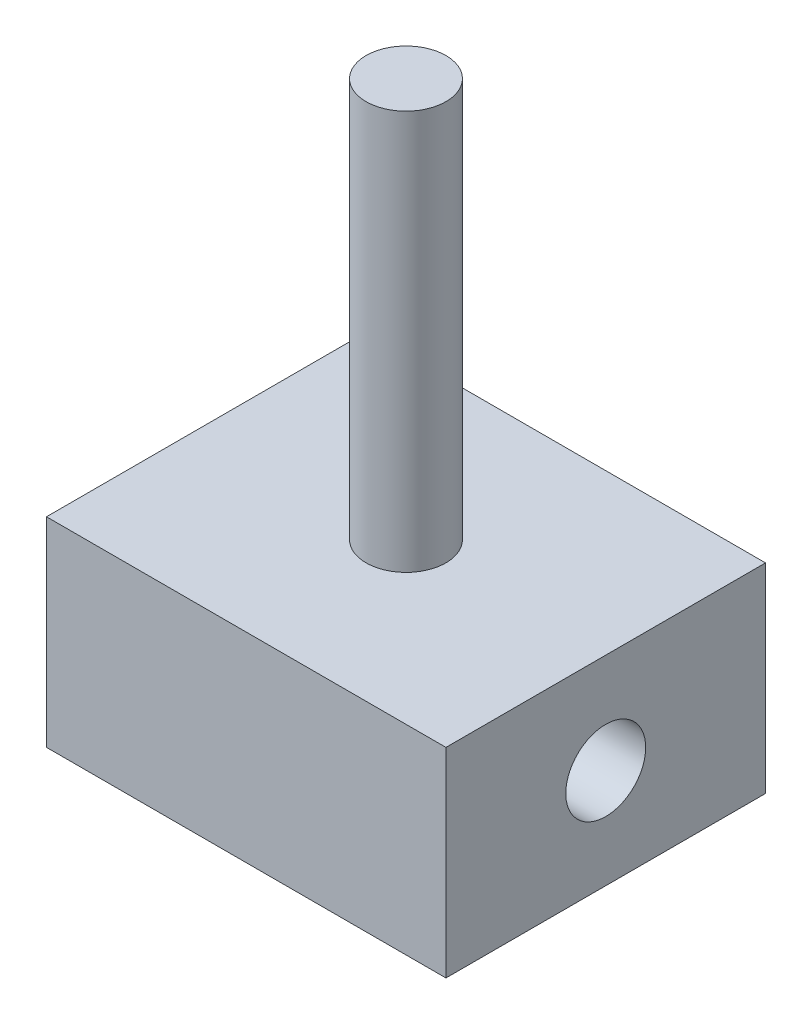
ISO-10303-21;
HEADER;
FILE_DESCRIPTION(('STEP AP214'),'2;1');
FILE_NAME('part.step','',(''),(''),'','','');
FILE_SCHEMA(('AUTOMOTIVE_DESIGN { 1 0 10303 214 1 1 1 1 }'));
ENDSEC;
DATA;
#1=APPLICATION_CONTEXT('core data for automotive mechanical design processes');
#2=APPLICATION_PROTOCOL_DEFINITION('international standard','automotive_design',2000,#1);
#3=PRODUCT_CONTEXT('',#1,'mechanical');
#4=PRODUCT('Part','Part','',(#3));
#5=PRODUCT_RELATED_PRODUCT_CATEGORY('part','',(#4));
#6=PRODUCT_DEFINITION_FORMATION('','',#4);
#7=PRODUCT_DEFINITION_CONTEXT('part definition',#1,'design');
#8=PRODUCT_DEFINITION('design','',#6,#7);
#9=PRODUCT_DEFINITION_SHAPE('','',#8);
#10=(LENGTH_UNIT() NAMED_UNIT(*) SI_UNIT(.MILLI.,.METRE.));
#11=(NAMED_UNIT(*) PLANE_ANGLE_UNIT() SI_UNIT($,.RADIAN.));
#12=(NAMED_UNIT(*) SI_UNIT($,.STERADIAN.) SOLID_ANGLE_UNIT());
#13=UNCERTAINTY_MEASURE_WITH_UNIT(LENGTH_MEASURE(1.E-05),#10,'distance_accuracy_value','');
#14=(GEOMETRIC_REPRESENTATION_CONTEXT(3) GLOBAL_UNCERTAINTY_ASSIGNED_CONTEXT((#13)) GLOBAL_UNIT_ASSIGNED_CONTEXT((#10,
#11,#12)) REPRESENTATION_CONTEXT('',''));
#15=CARTESIAN_POINT('',(0.,0.,0.));
#16=DIRECTION('',(0.,0.,1.));
#17=DIRECTION('',(1.,0.,0.));
#18=AXIS2_PLACEMENT_3D('',#15,#16,#17);
#19=CARTESIAN_POINT('',(0.,0.,20.));
#20=DIRECTION('',(0.,1.,0.));
#21=DIRECTION('',(-1.,0.,0.));
#22=AXIS2_PLACEMENT_3D('',#19,#20,#21);
#23=PLANE('',#22);
#24=DIRECTION('',(1.,0.,0.));
#25=VECTOR('',#24,1.);
#26=CARTESIAN_POINT('',(0.,0.,-20.));
#27=LINE('',#26,#25);
#28=CARTESIAN_POINT('',(-25.,0.,-20.));
#29=VERTEX_POINT('',#28);
#30=CARTESIAN_POINT('',(25.,0.,-20.));
#31=VERTEX_POINT('',#30);
#32=EDGE_CURVE('E102',#29,#31,#27,.T.);
#33=ORIENTED_EDGE('',*,*,#32,.T.);
#34=DIRECTION('',(0.,0.,-1.));
#35=VECTOR('',#34,1.);
#36=CARTESIAN_POINT('',(25.,0.,20.));
#37=LINE('',#36,#35);
#38=CARTESIAN_POINT('',(25.,0.,20.));
#39=VERTEX_POINT('',#38);
#40=EDGE_CURVE('E39',#39,#31,#37,.T.);
#41=ORIENTED_EDGE('',*,*,#40,.F.);
#42=DIRECTION('',(1.,0.,0.));
#43=VECTOR('',#42,1.);
#44=CARTESIAN_POINT('',(0.,0.,20.));
#45=LINE('',#44,#43);
#46=CARTESIAN_POINT('',(-25.,0.,20.));
#47=VERTEX_POINT('',#46);
#48=EDGE_CURVE('E87',#47,#39,#45,.T.);
#49=ORIENTED_EDGE('',*,*,#48,.F.);
#50=DIRECTION('',(0.,0.,-1.));
#51=VECTOR('',#50,1.);
#52=CARTESIAN_POINT('',(-25.,0.,20.));
#53=LINE('',#52,#51);
#54=EDGE_CURVE('E53',#47,#29,#53,.T.);
#55=ORIENTED_EDGE('',*,*,#54,.T.);
#56=EDGE_LOOP('',(#33,#41,#49,#55));
#57=FACE_BOUND('',#56,.T.);
#58=ADVANCED_FACE('F36',(#57),#23,.F.);
#59=CARTESIAN_POINT('',(25.,0.,20.));
#60=DIRECTION('',(-1.,0.,0.));
#61=DIRECTION('',(0.,-1.,0.));
#62=AXIS2_PLACEMENT_3D('',#59,#60,#61);
#63=PLANE('',#62);
#64=CARTESIAN_POINT('',(25.,12.5,0.));
#65=DIRECTION('',(1.,0.,0.));
#66=DIRECTION('',(0.,1.,0.));
#67=AXIS2_PLACEMENT_3D('',#64,#65,#66);
#68=CIRCLE('',#67,5.);
#69=CARTESIAN_POINT('',(25.,17.5,0.));
#70=VERTEX_POINT('',#69);
#71=EDGE_CURVE('E117',#70,#70,#68,.T.);
#72=ORIENTED_EDGE('',*,*,#71,.F.);
#73=EDGE_LOOP('',(#72));
#74=FACE_BOUND('',#73,.T.);
#75=DIRECTION('',(0.,1.,0.));
#76=VECTOR('',#75,1.);
#77=CARTESIAN_POINT('',(25.,0.,-20.));
#78=LINE('',#77,#76);
#79=CARTESIAN_POINT('',(25.,25.,-20.));
#80=VERTEX_POINT('',#79);
#81=EDGE_CURVE('E93',#31,#80,#78,.T.);
#82=ORIENTED_EDGE('',*,*,#81,.T.);
#83=DIRECTION('',(0.,0.,-1.));
#84=VECTOR('',#83,1.);
#85=CARTESIAN_POINT('',(25.,25.,20.));
#86=LINE('',#85,#84);
#87=CARTESIAN_POINT('',(25.,25.,20.));
#88=VERTEX_POINT('',#87);
#89=EDGE_CURVE('E91',#88,#80,#86,.T.);
#90=ORIENTED_EDGE('',*,*,#89,.F.);
#91=DIRECTION('',(0.,1.,0.));
#92=VECTOR('',#91,1.);
#93=CARTESIAN_POINT('',(25.,0.,20.));
#94=LINE('',#93,#92);
#95=EDGE_CURVE('E79',#39,#88,#94,.T.);
#96=ORIENTED_EDGE('',*,*,#95,.F.);
#97=ORIENTED_EDGE('',*,*,#40,.T.);
#98=EDGE_LOOP('',(#82,#90,#96,#97));
#99=FACE_BOUND('',#98,.T.);
#100=ADVANCED_FACE('F92',(#74,#99),#63,.F.);
#101=CARTESIAN_POINT('',(0.,25.,20.));
#102=DIRECTION('',(0.,1.,0.));
#103=DIRECTION('',(-1.,0.,0.));
#104=AXIS2_PLACEMENT_3D('',#101,#102,#103);
#105=PLANE('',#104);
#106=CARTESIAN_POINT('',(0.,25.,0.));
#107=DIRECTION('',(0.,1.,0.));
#108=DIRECTION('',(-1.,0.,0.));
#109=AXIS2_PLACEMENT_3D('',#106,#107,#108);
#110=CIRCLE('',#109,5.);
#111=CARTESIAN_POINT('',(-5.00000000000001,25.,0.));
#112=VERTEX_POINT('',#111);
#113=EDGE_CURVE('E11',#112,#112,#110,.T.);
#114=ORIENTED_EDGE('',*,*,#113,.F.);
#115=EDGE_LOOP('',(#114));
#116=FACE_BOUND('',#115,.T.);
#117=DIRECTION('',(1.,0.,0.));
#118=VECTOR('',#117,1.);
#119=CARTESIAN_POINT('',(0.,25.,-20.));
#120=LINE('',#119,#118);
#121=CARTESIAN_POINT('',(-25.,25.,-20.));
#122=VERTEX_POINT('',#121);
#123=EDGE_CURVE('E106',#122,#80,#120,.T.);
#124=ORIENTED_EDGE('',*,*,#123,.F.);
#125=DIRECTION('',(0.,0.,-1.));
#126=VECTOR('',#125,1.);
#127=CARTESIAN_POINT('',(-25.,25.,20.));
#128=LINE('',#127,#126);
#129=CARTESIAN_POINT('',(-25.,25.,20.));
#130=VERTEX_POINT('',#129);
#131=EDGE_CURVE('E67',#130,#122,#128,.T.);
#132=ORIENTED_EDGE('',*,*,#131,.F.);
#133=DIRECTION('',(1.,0.,0.));
#134=VECTOR('',#133,1.);
#135=CARTESIAN_POINT('',(0.,25.,20.));
#136=LINE('',#135,#134);
#137=EDGE_CURVE('E86',#130,#88,#136,.T.);
#138=ORIENTED_EDGE('',*,*,#137,.T.);
#139=ORIENTED_EDGE('',*,*,#89,.T.);
#140=EDGE_LOOP('',(#124,#132,#138,#139));
#141=FACE_BOUND('',#140,.T.);
#142=ADVANCED_FACE('F96',(#116,#141),#105,.T.);
#143=CARTESIAN_POINT('',(-25.,0.,20.));
#144=DIRECTION('',(-1.,0.,0.));
#145=DIRECTION('',(0.,0.,1.));
#146=AXIS2_PLACEMENT_3D('',#143,#144,#145);
#147=PLANE('',#146);
#148=CARTESIAN_POINT('',(-25.,12.5,0.));
#149=DIRECTION('',(1.,0.,0.));
#150=DIRECTION('',(0.,1.,0.));
#151=AXIS2_PLACEMENT_3D('',#148,#149,#150);
#152=CIRCLE('',#151,5.);
#153=CARTESIAN_POINT('',(-25.,17.5,0.));
#154=VERTEX_POINT('',#153);
#155=EDGE_CURVE('E116',#154,#154,#152,.T.);
#156=ORIENTED_EDGE('',*,*,#155,.T.);
#157=EDGE_LOOP('',(#156));
#158=FACE_BOUND('',#157,.T.);
#159=DIRECTION('',(0.,1.,0.));
#160=VECTOR('',#159,1.);
#161=CARTESIAN_POINT('',(-25.,0.,-20.));
#162=LINE('',#161,#160);
#163=EDGE_CURVE('E108',#29,#122,#162,.T.);
#164=ORIENTED_EDGE('',*,*,#163,.F.);
#165=ORIENTED_EDGE('',*,*,#54,.F.);
#166=DIRECTION('',(0.,1.,0.));
#167=VECTOR('',#166,1.);
#168=CARTESIAN_POINT('',(-25.,0.,20.));
#169=LINE('',#168,#167);
#170=EDGE_CURVE('E97',#47,#130,#169,.T.);
#171=ORIENTED_EDGE('',*,*,#170,.T.);
#172=ORIENTED_EDGE('',*,*,#131,.T.);
#173=EDGE_LOOP('',(#164,#165,#171,#172));
#174=FACE_BOUND('',#173,.T.);
#175=ADVANCED_FACE('F123',(#158,#174),#147,.T.);
#176=CARTESIAN_POINT('',(0.,0.,20.));
#177=DIRECTION('',(0.,0.,1.));
#178=DIRECTION('',(1.,0.,0.));
#179=AXIS2_PLACEMENT_3D('',#176,#177,#178);
#180=PLANE('',#179);
#181=ORIENTED_EDGE('',*,*,#48,.T.);
#182=ORIENTED_EDGE('',*,*,#95,.T.);
#183=ORIENTED_EDGE('',*,*,#137,.F.);
#184=ORIENTED_EDGE('',*,*,#170,.F.);
#185=EDGE_LOOP('',(#181,#182,#183,#184));
#186=FACE_BOUND('',#185,.T.);
#187=ADVANCED_FACE('F83',(#186),#180,.T.);
#188=CARTESIAN_POINT('',(0.,0.,-20.));
#189=DIRECTION('',(0.,0.,1.));
#190=DIRECTION('',(1.,0.,0.));
#191=AXIS2_PLACEMENT_3D('',#188,#189,#190);
#192=PLANE('',#191);
#193=ORIENTED_EDGE('',*,*,#32,.F.);
#194=ORIENTED_EDGE('',*,*,#163,.T.);
#195=ORIENTED_EDGE('',*,*,#123,.T.);
#196=ORIENTED_EDGE('',*,*,#81,.F.);
#197=EDGE_LOOP('',(#193,#194,#195,#196));
#198=FACE_BOUND('',#197,.T.);
#199=ADVANCED_FACE('F143',(#198),#192,.F.);
#200=CARTESIAN_POINT('',(0.,75.,0.));
#201=DIRECTION('',(0.,-1.,0.));
#202=DIRECTION('',(1.,0.,0.));
#203=AXIS2_PLACEMENT_3D('',#200,#201,#202);
#204=CYLINDRICAL_SURFACE('',#203,5.);
#205=CARTESIAN_POINT('',(0.,75.,0.));
#206=DIRECTION('',(0.,1.,0.));
#207=DIRECTION('',(-1.,0.,0.));
#208=AXIS2_PLACEMENT_3D('',#205,#206,#207);
#209=CIRCLE('',#208,5.);
#210=CARTESIAN_POINT('',(-5.00000000000002,75.,0.));
#211=VERTEX_POINT('',#210);
#212=EDGE_CURVE('E104',#211,#211,#209,.T.);
#213=ORIENTED_EDGE('',*,*,#212,.F.);
#214=EDGE_LOOP('',(#213));
#215=FACE_BOUND('',#214,.T.);
#216=ORIENTED_EDGE('',*,*,#113,.T.);
#217=EDGE_LOOP('',(#216));
#218=FACE_BOUND('',#217,.T.);
#219=ADVANCED_FACE('F146',(#215,#218),#204,.T.);
#220=CARTESIAN_POINT('',(0.,75.,0.));
#221=DIRECTION('',(0.,1.,0.));
#222=DIRECTION('',(-1.,0.,0.));
#223=AXIS2_PLACEMENT_3D('',#220,#221,#222);
#224=PLANE('',#223);
#225=ORIENTED_EDGE('',*,*,#212,.T.);
#226=EDGE_LOOP('',(#225));
#227=FACE_BOUND('',#226,.T.);
#228=ADVANCED_FACE('F128',(#227),#224,.T.);
#229=CARTESIAN_POINT('',(-25.,12.5,0.));
#230=DIRECTION('',(1.,0.,0.));
#231=DIRECTION('',(0.,1.,0.));
#232=AXIS2_PLACEMENT_3D('',#229,#230,#231);
#233=CYLINDRICAL_SURFACE('',#232,5.);
#234=ORIENTED_EDGE('',*,*,#155,.F.);
#235=EDGE_LOOP('',(#234));
#236=FACE_BOUND('',#235,.T.);
#237=ORIENTED_EDGE('',*,*,#71,.T.);
#238=EDGE_LOOP('',(#237));
#239=FACE_BOUND('',#238,.T.);
#240=ADVANCED_FACE('F125',(#236,#239),#233,.F.);
#241=CLOSED_SHELL('',(#58,#100,#142,#175,#187,#199,#219,#228,#240));
#242=MANIFOLD_SOLID_BREP('B2',#241);
#243=ADVANCED_BREP_SHAPE_REPRESENTATION('',(#18,#242),#14);
#244=SHAPE_DEFINITION_REPRESENTATION(#9,#243);
ENDSEC;
END-ISO-10303-21;
